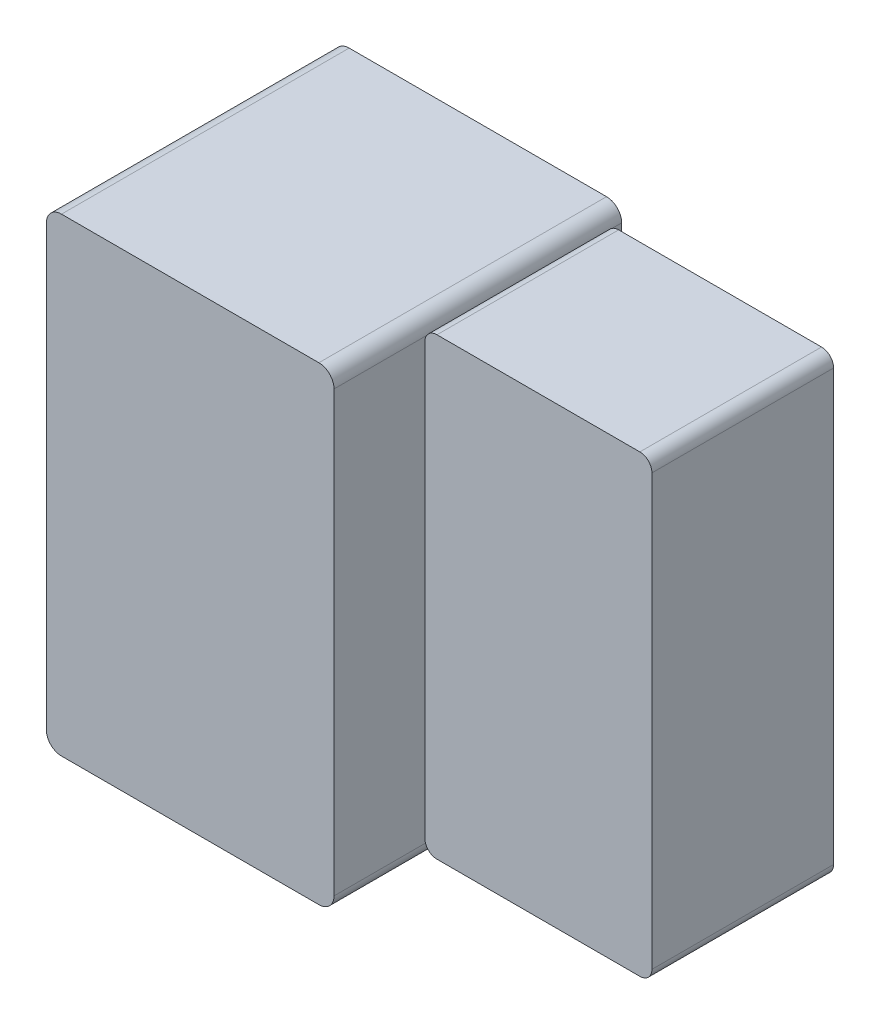
ISO-10303-21;
HEADER;
FILE_DESCRIPTION(('STEP AP214'),'2;1');
FILE_NAME('part.step','',(''),(''),'','','');
FILE_SCHEMA(('AUTOMOTIVE_DESIGN { 1 0 10303 214 1 1 1 1 }'));
ENDSEC;
DATA;
#1=APPLICATION_CONTEXT('core data for automotive mechanical design processes');
#2=APPLICATION_PROTOCOL_DEFINITION('international standard','automotive_design',2000,#1);
#3=PRODUCT_CONTEXT('',#1,'mechanical');
#4=PRODUCT('Part','Part','',(#3));
#5=PRODUCT_RELATED_PRODUCT_CATEGORY('part','',(#4));
#6=PRODUCT_DEFINITION_FORMATION('','',#4);
#7=PRODUCT_DEFINITION_CONTEXT('part definition',#1,'design');
#8=PRODUCT_DEFINITION('design','',#6,#7);
#9=PRODUCT_DEFINITION_SHAPE('','',#8);
#10=(LENGTH_UNIT() NAMED_UNIT(*) SI_UNIT(.MILLI.,.METRE.));
#11=(NAMED_UNIT(*) PLANE_ANGLE_UNIT() SI_UNIT($,.RADIAN.));
#12=(NAMED_UNIT(*) SI_UNIT($,.STERADIAN.) SOLID_ANGLE_UNIT());
#13=UNCERTAINTY_MEASURE_WITH_UNIT(LENGTH_MEASURE(1.E-05),#10,'distance_accuracy_value','');
#14=(GEOMETRIC_REPRESENTATION_CONTEXT(3) GLOBAL_UNCERTAINTY_ASSIGNED_CONTEXT((#13)) GLOBAL_UNIT_ASSIGNED_CONTEXT((#10,
#11,#12)) REPRESENTATION_CONTEXT('',''));
#15=CARTESIAN_POINT('',(0.,0.,0.));
#16=DIRECTION('',(0.,0.,1.));
#17=DIRECTION('',(1.,0.,0.));
#18=AXIS2_PLACEMENT_3D('',#15,#16,#17);
#19=CARTESIAN_POINT('',(4.5,-7.25,9.5));
#20=DIRECTION('',(0.,0.,-1.));
#21=DIRECTION('',(-1.,0.,0.));
#22=AXIS2_PLACEMENT_3D('',#19,#20,#21);
#23=CYLINDRICAL_SURFACE('',#22,0.5);
#24=CARTESIAN_POINT('',(4.5,-7.25,0.));
#25=DIRECTION('',(0.,0.,1.));
#26=DIRECTION('',(1.,0.,0.));
#27=AXIS2_PLACEMENT_3D('',#24,#25,#26);
#28=CIRCLE('',#27,0.5);
#29=CARTESIAN_POINT('',(4.,-7.25,0.));
#30=VERTEX_POINT('',#29);
#31=CARTESIAN_POINT('',(4.5,-7.75,0.));
#32=VERTEX_POINT('',#31);
#33=EDGE_CURVE('E172',#30,#32,#28,.T.);
#34=ORIENTED_EDGE('',*,*,#33,.T.);
#35=DIRECTION('',(0.,0.,-1.));
#36=VECTOR('',#35,1.);
#37=CARTESIAN_POINT('',(4.5,-7.75,9.5));
#38=LINE('',#37,#36);
#39=CARTESIAN_POINT('',(4.5,-7.75,9.5));
#40=VERTEX_POINT('',#39);
#41=EDGE_CURVE('E11',#40,#32,#38,.T.);
#42=ORIENTED_EDGE('',*,*,#41,.F.);
#43=CARTESIAN_POINT('',(4.5,-7.25,9.5));
#44=DIRECTION('',(0.,0.,1.));
#45=DIRECTION('',(1.,0.,0.));
#46=AXIS2_PLACEMENT_3D('',#43,#44,#45);
#47=CIRCLE('',#46,0.5);
#48=CARTESIAN_POINT('',(4.,-7.25,9.5));
#49=VERTEX_POINT('',#48);
#50=EDGE_CURVE('E181',#49,#40,#47,.T.);
#51=ORIENTED_EDGE('',*,*,#50,.F.);
#52=DIRECTION('',(0.,0.,-1.));
#53=VECTOR('',#52,1.);
#54=CARTESIAN_POINT('',(4.,-7.25,9.5));
#55=LINE('',#54,#53);
#56=EDGE_CURVE('E198',#49,#30,#55,.T.);
#57=ORIENTED_EDGE('',*,*,#56,.T.);
#58=EDGE_LOOP('',(#34,#42,#51,#57));
#59=FACE_BOUND('',#58,.T.);
#60=ADVANCED_FACE('F41',(#59),#23,.T.);
#61=CARTESIAN_POINT('',(4.5,-7.75,9.5));
#62=DIRECTION('',(0.,1.,0.));
#63=DIRECTION('',(0.,0.,1.));
#64=AXIS2_PLACEMENT_3D('',#61,#62,#63);
#65=PLANE('',#64);
#66=DIRECTION('',(1.,0.,0.));
#67=VECTOR('',#66,1.);
#68=CARTESIAN_POINT('',(4.5,-7.75,0.));
#69=LINE('',#68,#67);
#70=CARTESIAN_POINT('',(13.,-7.75,0.));
#71=VERTEX_POINT('',#70);
#72=EDGE_CURVE('E175',#32,#71,#69,.T.);
#73=ORIENTED_EDGE('',*,*,#72,.T.);
#74=DIRECTION('',(0.,0.,-1.));
#75=VECTOR('',#74,1.);
#76=CARTESIAN_POINT('',(13.,-7.75,9.5));
#77=LINE('',#76,#75);
#78=CARTESIAN_POINT('',(13.,-7.75,9.5));
#79=VERTEX_POINT('',#78);
#80=EDGE_CURVE('E48',#79,#71,#77,.T.);
#81=ORIENTED_EDGE('',*,*,#80,.F.);
#82=DIRECTION('',(1.,0.,0.));
#83=VECTOR('',#82,1.);
#84=CARTESIAN_POINT('',(4.5,-7.75,9.5));
#85=LINE('',#84,#83);
#86=EDGE_CURVE('E184',#40,#79,#85,.T.);
#87=ORIENTED_EDGE('',*,*,#86,.F.);
#88=ORIENTED_EDGE('',*,*,#41,.T.);
#89=EDGE_LOOP('',(#73,#81,#87,#88));
#90=FACE_BOUND('',#89,.T.);
#91=ADVANCED_FACE('F256',(#90),#65,.F.);
#92=CARTESIAN_POINT('',(13.,-7.25,9.5));
#93=DIRECTION('',(0.,0.,-1.));
#94=DIRECTION('',(-1.,0.,0.));
#95=AXIS2_PLACEMENT_3D('',#92,#93,#94);
#96=CYLINDRICAL_SURFACE('',#95,0.499999999999999);
#97=CARTESIAN_POINT('',(13.,-7.25,0.));
#98=DIRECTION('',(0.,0.,1.));
#99=DIRECTION('',(1.,0.,0.));
#100=AXIS2_PLACEMENT_3D('',#97,#98,#99);
#101=CIRCLE('',#100,0.499999999999999);
#102=CARTESIAN_POINT('',(13.5,-7.25,0.));
#103=VERTEX_POINT('',#102);
#104=EDGE_CURVE('E201',#71,#103,#101,.T.);
#105=ORIENTED_EDGE('',*,*,#104,.T.);
#106=DIRECTION('',(0.,0.,-1.));
#107=VECTOR('',#106,1.);
#108=CARTESIAN_POINT('',(13.5,-7.25,9.5));
#109=LINE('',#108,#107);
#110=CARTESIAN_POINT('',(13.5,-7.25,9.5));
#111=VERTEX_POINT('',#110);
#112=EDGE_CURVE('E226',#111,#103,#109,.T.);
#113=ORIENTED_EDGE('',*,*,#112,.F.);
#114=CARTESIAN_POINT('',(13.,-7.25,9.5));
#115=DIRECTION('',(0.,0.,1.));
#116=DIRECTION('',(1.,0.,0.));
#117=AXIS2_PLACEMENT_3D('',#114,#115,#116);
#118=CIRCLE('',#117,0.499999999999999);
#119=EDGE_CURVE('E187',#79,#111,#118,.T.);
#120=ORIENTED_EDGE('',*,*,#119,.F.);
#121=ORIENTED_EDGE('',*,*,#80,.T.);
#122=EDGE_LOOP('',(#105,#113,#120,#121));
#123=FACE_BOUND('',#122,.T.);
#124=ADVANCED_FACE('F233',(#123),#96,.T.);
#125=CARTESIAN_POINT('',(13.5,-7.25,9.5));
#126=DIRECTION('',(-1.,0.,0.));
#127=DIRECTION('',(0.,0.,1.));
#128=AXIS2_PLACEMENT_3D('',#125,#126,#127);
#129=PLANE('',#128);
#130=DIRECTION('',(0.,0.,-1.));
#131=VECTOR('',#130,1.);
#132=CARTESIAN_POINT('',(13.5,-7.1,6.5));
#133=LINE('',#132,#131);
#134=CARTESIAN_POINT('',(13.5,-7.1,6.5));
#135=VERTEX_POINT('',#134);
#136=CARTESIAN_POINT('',(13.5,-7.1,0.5));
#137=VERTEX_POINT('',#136);
#138=EDGE_CURVE('E55',#135,#137,#133,.T.);
#139=ORIENTED_EDGE('',*,*,#138,.F.);
#140=DIRECTION('',(0.,-1.,0.));
#141=VECTOR('',#140,1.);
#142=CARTESIAN_POINT('',(13.5,7.1,6.5));
#143=LINE('',#142,#141);
#144=CARTESIAN_POINT('',(13.5,7.1,6.5));
#145=VERTEX_POINT('',#144);
#146=EDGE_CURVE('E59',#145,#135,#143,.T.);
#147=ORIENTED_EDGE('',*,*,#146,.F.);
#148=DIRECTION('',(0.,0.,-1.));
#149=VECTOR('',#148,1.);
#150=CARTESIAN_POINT('',(13.5,7.1,6.5));
#151=LINE('',#150,#149);
#152=CARTESIAN_POINT('',(13.5,7.1,0.5));
#153=VERTEX_POINT('',#152);
#154=EDGE_CURVE('E454',#145,#153,#151,.T.);
#155=ORIENTED_EDGE('',*,*,#154,.T.);
#156=DIRECTION('',(0.,-1.,0.));
#157=VECTOR('',#156,1.);
#158=CARTESIAN_POINT('',(13.5,7.1,0.5));
#159=LINE('',#158,#157);
#160=EDGE_CURVE('E167',#153,#137,#159,.T.);
#161=ORIENTED_EDGE('',*,*,#160,.T.);
#162=EDGE_LOOP('',(#139,#147,#155,#161));
#163=FACE_BOUND('',#162,.T.);
#164=DIRECTION('',(0.,1.,0.));
#165=VECTOR('',#164,1.);
#166=CARTESIAN_POINT('',(13.5,-7.25,0.));
#167=LINE('',#166,#165);
#168=CARTESIAN_POINT('',(13.5,7.25,0.));
#169=VERTEX_POINT('',#168);
#170=EDGE_CURVE('E203',#103,#169,#167,.T.);
#171=ORIENTED_EDGE('',*,*,#170,.T.);
#172=DIRECTION('',(0.,0.,-1.));
#173=VECTOR('',#172,1.);
#174=CARTESIAN_POINT('',(13.5,7.25,9.5));
#175=LINE('',#174,#173);
#176=CARTESIAN_POINT('',(13.5,7.25,9.5));
#177=VERTEX_POINT('',#176);
#178=EDGE_CURVE('E223',#177,#169,#175,.T.);
#179=ORIENTED_EDGE('',*,*,#178,.F.);
#180=DIRECTION('',(0.,1.,0.));
#181=VECTOR('',#180,1.);
#182=CARTESIAN_POINT('',(13.5,-7.25,9.5));
#183=LINE('',#182,#181);
#184=EDGE_CURVE('E189',#111,#177,#183,.T.);
#185=ORIENTED_EDGE('',*,*,#184,.F.);
#186=ORIENTED_EDGE('',*,*,#112,.T.);
#187=EDGE_LOOP('',(#171,#179,#185,#186));
#188=FACE_BOUND('',#187,.T.);
#189=ADVANCED_FACE('F244',(#163,#188),#129,.F.);
#190=CARTESIAN_POINT('',(13.,7.25,9.5));
#191=DIRECTION('',(0.,0.,-1.));
#192=DIRECTION('',(-1.,0.,0.));
#193=AXIS2_PLACEMENT_3D('',#190,#191,#192);
#194=CYLINDRICAL_SURFACE('',#193,0.499999999999999);
#195=CARTESIAN_POINT('',(13.,7.25,0.));
#196=DIRECTION('',(0.,0.,1.));
#197=DIRECTION('',(1.,0.,0.));
#198=AXIS2_PLACEMENT_3D('',#195,#196,#197);
#199=CIRCLE('',#198,0.499999999999999);
#200=CARTESIAN_POINT('',(13.,7.75,0.));
#201=VERTEX_POINT('',#200);
#202=EDGE_CURVE('E205',#169,#201,#199,.T.);
#203=ORIENTED_EDGE('',*,*,#202,.T.);
#204=DIRECTION('',(0.,0.,-1.));
#205=VECTOR('',#204,1.);
#206=CARTESIAN_POINT('',(13.,7.75,9.5));
#207=LINE('',#206,#205);
#208=CARTESIAN_POINT('',(13.,7.75,9.5));
#209=VERTEX_POINT('',#208);
#210=EDGE_CURVE('E220',#209,#201,#207,.T.);
#211=ORIENTED_EDGE('',*,*,#210,.F.);
#212=CARTESIAN_POINT('',(13.,7.25,9.5));
#213=DIRECTION('',(0.,0.,1.));
#214=DIRECTION('',(1.,0.,0.));
#215=AXIS2_PLACEMENT_3D('',#212,#213,#214);
#216=CIRCLE('',#215,0.499999999999999);
#217=EDGE_CURVE('E191',#177,#209,#216,.T.);
#218=ORIENTED_EDGE('',*,*,#217,.F.);
#219=ORIENTED_EDGE('',*,*,#178,.T.);
#220=EDGE_LOOP('',(#203,#211,#218,#219));
#221=FACE_BOUND('',#220,.T.);
#222=ADVANCED_FACE('F248',(#221),#194,.T.);
#223=CARTESIAN_POINT('',(13.,7.75,9.5));
#224=DIRECTION('',(0.,-1.,0.));
#225=DIRECTION('',(0.,0.,-1.));
#226=AXIS2_PLACEMENT_3D('',#223,#224,#225);
#227=PLANE('',#226);
#228=DIRECTION('',(-1.,0.,0.));
#229=VECTOR('',#228,1.);
#230=CARTESIAN_POINT('',(13.,7.75,0.));
#231=LINE('',#230,#229);
#232=CARTESIAN_POINT('',(4.5,7.75,0.));
#233=VERTEX_POINT('',#232);
#234=EDGE_CURVE('E207',#201,#233,#231,.T.);
#235=ORIENTED_EDGE('',*,*,#234,.T.);
#236=DIRECTION('',(0.,0.,-1.));
#237=VECTOR('',#236,1.);
#238=CARTESIAN_POINT('',(4.5,7.75,9.5));
#239=LINE('',#238,#237);
#240=CARTESIAN_POINT('',(4.5,7.75,9.5));
#241=VERTEX_POINT('',#240);
#242=EDGE_CURVE('E217',#241,#233,#239,.T.);
#243=ORIENTED_EDGE('',*,*,#242,.F.);
#244=DIRECTION('',(-1.,0.,0.));
#245=VECTOR('',#244,1.);
#246=CARTESIAN_POINT('',(13.,7.75,9.5));
#247=LINE('',#246,#245);
#248=EDGE_CURVE('E193',#209,#241,#247,.T.);
#249=ORIENTED_EDGE('',*,*,#248,.F.);
#250=ORIENTED_EDGE('',*,*,#210,.T.);
#251=EDGE_LOOP('',(#235,#243,#249,#250));
#252=FACE_BOUND('',#251,.T.);
#253=ADVANCED_FACE('F269',(#252),#227,.F.);
#254=CARTESIAN_POINT('',(4.5,7.25,9.5));
#255=DIRECTION('',(0.,0.,-1.));
#256=DIRECTION('',(-1.,0.,0.));
#257=AXIS2_PLACEMENT_3D('',#254,#255,#256);
#258=CYLINDRICAL_SURFACE('',#257,0.5);
#259=CARTESIAN_POINT('',(4.5,7.25,0.));
#260=DIRECTION('',(0.,0.,1.));
#261=DIRECTION('',(1.,0.,0.));
#262=AXIS2_PLACEMENT_3D('',#259,#260,#261);
#263=CIRCLE('',#262,0.5);
#264=CARTESIAN_POINT('',(4.,7.25,0.));
#265=VERTEX_POINT('',#264);
#266=EDGE_CURVE('E209',#233,#265,#263,.T.);
#267=ORIENTED_EDGE('',*,*,#266,.T.);
#268=DIRECTION('',(0.,0.,-1.));
#269=VECTOR('',#268,1.);
#270=CARTESIAN_POINT('',(4.,7.25,9.5));
#271=LINE('',#270,#269);
#272=CARTESIAN_POINT('',(4.,7.25,9.5));
#273=VERTEX_POINT('',#272);
#274=EDGE_CURVE('E214',#273,#265,#271,.T.);
#275=ORIENTED_EDGE('',*,*,#274,.F.);
#276=CARTESIAN_POINT('',(4.5,7.25,9.5));
#277=DIRECTION('',(0.,0.,1.));
#278=DIRECTION('',(1.,0.,0.));
#279=AXIS2_PLACEMENT_3D('',#276,#277,#278);
#280=CIRCLE('',#279,0.5);
#281=EDGE_CURVE('E195',#241,#273,#280,.T.);
#282=ORIENTED_EDGE('',*,*,#281,.F.);
#283=ORIENTED_EDGE('',*,*,#242,.T.);
#284=EDGE_LOOP('',(#267,#275,#282,#283));
#285=FACE_BOUND('',#284,.T.);
#286=ADVANCED_FACE('F267',(#285),#258,.T.);
#287=CARTESIAN_POINT('',(4.,7.25,9.5));
#288=DIRECTION('',(1.,0.,0.));
#289=DIRECTION('',(0.,0.,-1.));
#290=AXIS2_PLACEMENT_3D('',#287,#288,#289);
#291=PLANE('',#290);
#292=DIRECTION('',(0.,-1.,0.));
#293=VECTOR('',#292,1.);
#294=CARTESIAN_POINT('',(4.,7.25,0.));
#295=LINE('',#294,#293);
#296=EDGE_CURVE('E185',#265,#30,#295,.T.);
#297=ORIENTED_EDGE('',*,*,#296,.T.);
#298=ORIENTED_EDGE('',*,*,#56,.F.);
#299=DIRECTION('',(0.,-1.,0.));
#300=VECTOR('',#299,1.);
#301=CARTESIAN_POINT('',(4.,7.25,9.5));
#302=LINE('',#301,#300);
#303=EDGE_CURVE('E197',#273,#49,#302,.T.);
#304=ORIENTED_EDGE('',*,*,#303,.F.);
#305=ORIENTED_EDGE('',*,*,#274,.T.);
#306=EDGE_LOOP('',(#297,#298,#304,#305));
#307=FACE_BOUND('',#306,.T.);
#308=ADVANCED_FACE('F262',(#307),#291,.F.);
#309=CARTESIAN_POINT('',(4.5,-7.25,9.5));
#310=DIRECTION('',(0.,0.,1.));
#311=DIRECTION('',(1.,0.,0.));
#312=AXIS2_PLACEMENT_3D('',#309,#310,#311);
#313=PLANE('',#312);
#314=ORIENTED_EDGE('',*,*,#50,.T.);
#315=ORIENTED_EDGE('',*,*,#86,.T.);
#316=ORIENTED_EDGE('',*,*,#119,.T.);
#317=ORIENTED_EDGE('',*,*,#184,.T.);
#318=ORIENTED_EDGE('',*,*,#217,.T.);
#319=ORIENTED_EDGE('',*,*,#248,.T.);
#320=ORIENTED_EDGE('',*,*,#281,.T.);
#321=ORIENTED_EDGE('',*,*,#303,.T.);
#322=EDGE_LOOP('',(#314,#315,#316,#317,#318,#319,#320,#321));
#323=FACE_BOUND('',#322,.T.);
#324=ADVANCED_FACE('F252',(#323),#313,.T.);
#325=CARTESIAN_POINT('',(4.5,-7.25,0.));
#326=DIRECTION('',(0.,0.,1.));
#327=DIRECTION('',(1.,0.,0.));
#328=AXIS2_PLACEMENT_3D('',#325,#326,#327);
#329=PLANE('',#328);
#330=ORIENTED_EDGE('',*,*,#33,.F.);
#331=ORIENTED_EDGE('',*,*,#296,.F.);
#332=ORIENTED_EDGE('',*,*,#266,.F.);
#333=ORIENTED_EDGE('',*,*,#234,.F.);
#334=ORIENTED_EDGE('',*,*,#202,.F.);
#335=ORIENTED_EDGE('',*,*,#170,.F.);
#336=ORIENTED_EDGE('',*,*,#104,.F.);
#337=ORIENTED_EDGE('',*,*,#72,.F.);
#338=EDGE_LOOP('',(#330,#331,#332,#333,#334,#335,#336,#337));
#339=FACE_BOUND('',#338,.T.);
#340=ADVANCED_FACE('F239',(#339),#329,.F.);
#341=CARTESIAN_POINT('',(13.9,-7.1,6.5));
#342=DIRECTION('',(0.,0.,-1.));
#343=DIRECTION('',(-1.,0.,0.));
#344=AXIS2_PLACEMENT_3D('',#341,#342,#343);
#345=CYLINDRICAL_SURFACE('',#344,0.400000000000001);
#346=CARTESIAN_POINT('',(13.9,-7.1,0.5));
#347=DIRECTION('',(0.,0.,1.));
#348=DIRECTION('',(1.,0.,0.));
#349=AXIS2_PLACEMENT_3D('',#346,#347,#348);
#350=CIRCLE('',#349,0.400000000000001);
#351=CARTESIAN_POINT('',(13.9,-7.5,0.5));
#352=VERTEX_POINT('',#351);
#353=EDGE_CURVE('E171',#137,#352,#350,.T.);
#354=ORIENTED_EDGE('',*,*,#353,.T.);
#355=DIRECTION('',(0.,0.,-1.));
#356=VECTOR('',#355,1.);
#357=CARTESIAN_POINT('',(13.9,-7.5,6.5));
#358=LINE('',#357,#356);
#359=CARTESIAN_POINT('',(13.9,-7.5,6.5));
#360=VERTEX_POINT('',#359);
#361=EDGE_CURVE('E155',#360,#352,#358,.T.);
#362=ORIENTED_EDGE('',*,*,#361,.F.);
#363=CARTESIAN_POINT('',(13.9,-7.1,6.5));
#364=DIRECTION('',(0.,0.,1.));
#365=DIRECTION('',(1.,0.,0.));
#366=AXIS2_PLACEMENT_3D('',#363,#364,#365);
#367=CIRCLE('',#366,0.400000000000001);
#368=EDGE_CURVE('E162',#135,#360,#367,.T.);
#369=ORIENTED_EDGE('',*,*,#368,.F.);
#370=ORIENTED_EDGE('',*,*,#138,.T.);
#371=EDGE_LOOP('',(#354,#362,#369,#370));
#372=FACE_BOUND('',#371,.T.);
#373=ADVANCED_FACE('F169',(#372),#345,.T.);
#374=CARTESIAN_POINT('',(13.9,-7.5,6.5));
#375=DIRECTION('',(0.,1.,0.));
#376=DIRECTION('',(0.,0.,1.));
#377=AXIS2_PLACEMENT_3D('',#374,#375,#376);
#378=PLANE('',#377);
#379=DIRECTION('',(1.,0.,0.));
#380=VECTOR('',#379,1.);
#381=CARTESIAN_POINT('',(13.9,-7.5,0.5));
#382=LINE('',#381,#380);
#383=CARTESIAN_POINT('',(20.6,-7.5,0.5));
#384=VERTEX_POINT('',#383);
#385=EDGE_CURVE('E435',#352,#384,#382,.T.);
#386=ORIENTED_EDGE('',*,*,#385,.T.);
#387=DIRECTION('',(0.,0.,-1.));
#388=VECTOR('',#387,1.);
#389=CARTESIAN_POINT('',(20.6,-7.5,6.5));
#390=LINE('',#389,#388);
#391=CARTESIAN_POINT('',(20.6,-7.5,6.5));
#392=VERTEX_POINT('',#391);
#393=EDGE_CURVE('E158',#392,#384,#390,.T.);
#394=ORIENTED_EDGE('',*,*,#393,.F.);
#395=DIRECTION('',(1.,0.,0.));
#396=VECTOR('',#395,1.);
#397=CARTESIAN_POINT('',(13.9,-7.5,6.5));
#398=LINE('',#397,#396);
#399=EDGE_CURVE('E151',#360,#392,#398,.T.);
#400=ORIENTED_EDGE('',*,*,#399,.F.);
#401=ORIENTED_EDGE('',*,*,#361,.T.);
#402=EDGE_LOOP('',(#386,#394,#400,#401));
#403=FACE_BOUND('',#402,.T.);
#404=ADVANCED_FACE('F153',(#403),#378,.F.);
#405=CARTESIAN_POINT('',(20.6,-7.1,6.5));
#406=DIRECTION('',(0.,0.,-1.));
#407=DIRECTION('',(-1.,0.,0.));
#408=AXIS2_PLACEMENT_3D('',#405,#406,#407);
#409=CYLINDRICAL_SURFACE('',#408,0.400000000000001);
#410=CARTESIAN_POINT('',(20.6,-7.1,0.5));
#411=DIRECTION('',(0.,0.,1.));
#412=DIRECTION('',(1.,0.,0.));
#413=AXIS2_PLACEMENT_3D('',#410,#411,#412);
#414=CIRCLE('',#413,0.400000000000001);
#415=CARTESIAN_POINT('',(21.,-7.1,0.5));
#416=VERTEX_POINT('',#415);
#417=EDGE_CURVE('E437',#384,#416,#414,.T.);
#418=ORIENTED_EDGE('',*,*,#417,.T.);
#419=DIRECTION('',(0.,0.,-1.));
#420=VECTOR('',#419,1.);
#421=CARTESIAN_POINT('',(21.,-7.1,6.5));
#422=LINE('',#421,#420);
#423=CARTESIAN_POINT('',(21.,-7.1,6.5));
#424=VERTEX_POINT('',#423);
#425=EDGE_CURVE('E177',#424,#416,#422,.T.);
#426=ORIENTED_EDGE('',*,*,#425,.F.);
#427=CARTESIAN_POINT('',(20.6,-7.1,6.5));
#428=DIRECTION('',(0.,0.,1.));
#429=DIRECTION('',(1.,0.,0.));
#430=AXIS2_PLACEMENT_3D('',#427,#428,#429);
#431=CIRCLE('',#430,0.400000000000001);
#432=EDGE_CURVE('E161',#392,#424,#431,.T.);
#433=ORIENTED_EDGE('',*,*,#432,.F.);
#434=ORIENTED_EDGE('',*,*,#393,.T.);
#435=EDGE_LOOP('',(#418,#426,#433,#434));
#436=FACE_BOUND('',#435,.T.);
#437=ADVANCED_FACE('F310',(#436),#409,.T.);
#438=CARTESIAN_POINT('',(21.,-7.1,6.5));
#439=DIRECTION('',(-1.,0.,0.));
#440=DIRECTION('',(0.,0.,1.));
#441=AXIS2_PLACEMENT_3D('',#438,#439,#440);
#442=PLANE('',#441);
#443=DIRECTION('',(0.,1.,0.));
#444=VECTOR('',#443,1.);
#445=CARTESIAN_POINT('',(21.,-7.1,0.5));
#446=LINE('',#445,#444);
#447=CARTESIAN_POINT('',(21.,7.1,0.5));
#448=VERTEX_POINT('',#447);
#449=EDGE_CURVE('E443',#416,#448,#446,.T.);
#450=ORIENTED_EDGE('',*,*,#449,.T.);
#451=DIRECTION('',(0.,0.,-1.));
#452=VECTOR('',#451,1.);
#453=CARTESIAN_POINT('',(21.,7.1,6.5));
#454=LINE('',#453,#452);
#455=CARTESIAN_POINT('',(21.,7.1,6.5));
#456=VERTEX_POINT('',#455);
#457=EDGE_CURVE('E462',#456,#448,#454,.T.);
#458=ORIENTED_EDGE('',*,*,#457,.F.);
#459=DIRECTION('',(0.,1.,0.));
#460=VECTOR('',#459,1.);
#461=CARTESIAN_POINT('',(21.,-7.1,6.5));
#462=LINE('',#461,#460);
#463=EDGE_CURVE('E469',#424,#456,#462,.T.);
#464=ORIENTED_EDGE('',*,*,#463,.F.);
#465=ORIENTED_EDGE('',*,*,#425,.T.);
#466=EDGE_LOOP('',(#450,#458,#464,#465));
#467=FACE_BOUND('',#466,.T.);
#468=ADVANCED_FACE('F318',(#467),#442,.F.);
#469=CARTESIAN_POINT('',(20.6,7.1,6.5));
#470=DIRECTION('',(0.,0.,-1.));
#471=DIRECTION('',(-1.,0.,0.));
#472=AXIS2_PLACEMENT_3D('',#469,#470,#471);
#473=CYLINDRICAL_SURFACE('',#472,0.400000000000001);
#474=CARTESIAN_POINT('',(20.6,7.1,0.5));
#475=DIRECTION('',(0.,0.,1.));
#476=DIRECTION('',(1.,0.,0.));
#477=AXIS2_PLACEMENT_3D('',#474,#475,#476);
#478=CIRCLE('',#477,0.400000000000001);
#479=CARTESIAN_POINT('',(20.6,7.5,0.5));
#480=VERTEX_POINT('',#479);
#481=EDGE_CURVE('E445',#448,#480,#478,.T.);
#482=ORIENTED_EDGE('',*,*,#481,.T.);
#483=DIRECTION('',(0.,0.,-1.));
#484=VECTOR('',#483,1.);
#485=CARTESIAN_POINT('',(20.6,7.5,6.5));
#486=LINE('',#485,#484);
#487=CARTESIAN_POINT('',(20.6,7.5,6.5));
#488=VERTEX_POINT('',#487);
#489=EDGE_CURVE('E459',#488,#480,#486,.T.);
#490=ORIENTED_EDGE('',*,*,#489,.F.);
#491=CARTESIAN_POINT('',(20.6,7.1,6.5));
#492=DIRECTION('',(0.,0.,1.));
#493=DIRECTION('',(1.,0.,0.));
#494=AXIS2_PLACEMENT_3D('',#491,#492,#493);
#495=CIRCLE('',#494,0.400000000000001);
#496=EDGE_CURVE('E479',#456,#488,#495,.T.);
#497=ORIENTED_EDGE('',*,*,#496,.F.);
#498=ORIENTED_EDGE('',*,*,#457,.T.);
#499=EDGE_LOOP('',(#482,#490,#497,#498));
#500=FACE_BOUND('',#499,.T.);
#501=ADVANCED_FACE('F327',(#500),#473,.T.);
#502=CARTESIAN_POINT('',(20.6,7.5,6.5));
#503=DIRECTION('',(0.,-1.,0.));
#504=DIRECTION('',(0.,0.,-1.));
#505=AXIS2_PLACEMENT_3D('',#502,#503,#504);
#506=PLANE('',#505);
#507=DIRECTION('',(-1.,0.,0.));
#508=VECTOR('',#507,1.);
#509=CARTESIAN_POINT('',(20.6,7.5,0.5));
#510=LINE('',#509,#508);
#511=CARTESIAN_POINT('',(13.9,7.5,0.5));
#512=VERTEX_POINT('',#511);
#513=EDGE_CURVE('E447',#480,#512,#510,.T.);
#514=ORIENTED_EDGE('',*,*,#513,.T.);
#515=DIRECTION('',(0.,0.,-1.));
#516=VECTOR('',#515,1.);
#517=CARTESIAN_POINT('',(13.9,7.5,6.5));
#518=LINE('',#517,#516);
#519=CARTESIAN_POINT('',(13.9,7.5,6.5));
#520=VERTEX_POINT('',#519);
#521=EDGE_CURVE('E456',#520,#512,#518,.T.);
#522=ORIENTED_EDGE('',*,*,#521,.F.);
#523=DIRECTION('',(-1.,0.,0.));
#524=VECTOR('',#523,1.);
#525=CARTESIAN_POINT('',(20.6,7.5,6.5));
#526=LINE('',#525,#524);
#527=EDGE_CURVE('E476',#488,#520,#526,.T.);
#528=ORIENTED_EDGE('',*,*,#527,.F.);
#529=ORIENTED_EDGE('',*,*,#489,.T.);
#530=EDGE_LOOP('',(#514,#522,#528,#529));
#531=FACE_BOUND('',#530,.T.);
#532=ADVANCED_FACE('F336',(#531),#506,.F.);
#533=CARTESIAN_POINT('',(13.9,7.1,6.5));
#534=DIRECTION('',(0.,0.,-1.));
#535=DIRECTION('',(-1.,0.,0.));
#536=AXIS2_PLACEMENT_3D('',#533,#534,#535);
#537=CYLINDRICAL_SURFACE('',#536,0.400000000000001);
#538=CARTESIAN_POINT('',(13.9,7.1,0.5));
#539=DIRECTION('',(0.,0.,1.));
#540=DIRECTION('',(1.,0.,0.));
#541=AXIS2_PLACEMENT_3D('',#538,#539,#540);
#542=CIRCLE('',#541,0.400000000000001);
#543=EDGE_CURVE('E449',#512,#153,#542,.T.);
#544=ORIENTED_EDGE('',*,*,#543,.T.);
#545=ORIENTED_EDGE('',*,*,#154,.F.);
#546=CARTESIAN_POINT('',(13.9,7.1,6.5));
#547=DIRECTION('',(0.,0.,1.));
#548=DIRECTION('',(1.,0.,0.));
#549=AXIS2_PLACEMENT_3D('',#546,#547,#548);
#550=CIRCLE('',#549,0.400000000000001);
#551=EDGE_CURVE('E478',#520,#145,#550,.T.);
#552=ORIENTED_EDGE('',*,*,#551,.F.);
#553=ORIENTED_EDGE('',*,*,#521,.T.);
#554=EDGE_LOOP('',(#544,#545,#552,#553));
#555=FACE_BOUND('',#554,.T.);
#556=ADVANCED_FACE('F345',(#555),#537,.T.);
#557=CARTESIAN_POINT('',(13.9,-7.1,6.5));
#558=DIRECTION('',(0.,0.,1.));
#559=DIRECTION('',(1.,0.,0.));
#560=AXIS2_PLACEMENT_3D('',#557,#558,#559);
#561=PLANE('',#560);
#562=ORIENTED_EDGE('',*,*,#368,.T.);
#563=ORIENTED_EDGE('',*,*,#399,.T.);
#564=ORIENTED_EDGE('',*,*,#432,.T.);
#565=ORIENTED_EDGE('',*,*,#463,.T.);
#566=ORIENTED_EDGE('',*,*,#496,.T.);
#567=ORIENTED_EDGE('',*,*,#527,.T.);
#568=ORIENTED_EDGE('',*,*,#551,.T.);
#569=ORIENTED_EDGE('',*,*,#146,.T.);
#570=EDGE_LOOP('',(#562,#563,#564,#565,#566,#567,#568,#569));
#571=FACE_BOUND('',#570,.T.);
#572=ADVANCED_FACE('F165',(#571),#561,.T.);
#573=CARTESIAN_POINT('',(13.9,-7.1,0.5));
#574=DIRECTION('',(0.,0.,1.));
#575=DIRECTION('',(1.,0.,0.));
#576=AXIS2_PLACEMENT_3D('',#573,#574,#575);
#577=PLANE('',#576);
#578=ORIENTED_EDGE('',*,*,#353,.F.);
#579=ORIENTED_EDGE('',*,*,#160,.F.);
#580=ORIENTED_EDGE('',*,*,#543,.F.);
#581=ORIENTED_EDGE('',*,*,#513,.F.);
#582=ORIENTED_EDGE('',*,*,#481,.F.);
#583=ORIENTED_EDGE('',*,*,#449,.F.);
#584=ORIENTED_EDGE('',*,*,#417,.F.);
#585=ORIENTED_EDGE('',*,*,#385,.F.);
#586=EDGE_LOOP('',(#578,#579,#580,#581,#582,#583,#584,#585));
#587=FACE_BOUND('',#586,.T.);
#588=ADVANCED_FACE('F362',(#587),#577,.F.);
#589=CLOSED_SHELL('',(#60,#91,#124,#189,#222,#253,#286,#308,#324,#340,#373,#404,#437,#468,#501,
#532,#556,#572,#588));
#590=MANIFOLD_SOLID_BREP('B2',#589);
#591=ADVANCED_BREP_SHAPE_REPRESENTATION('',(#18,#590),#14);
#592=SHAPE_DEFINITION_REPRESENTATION(#9,#591);
ENDSEC;
END-ISO-10303-21;
